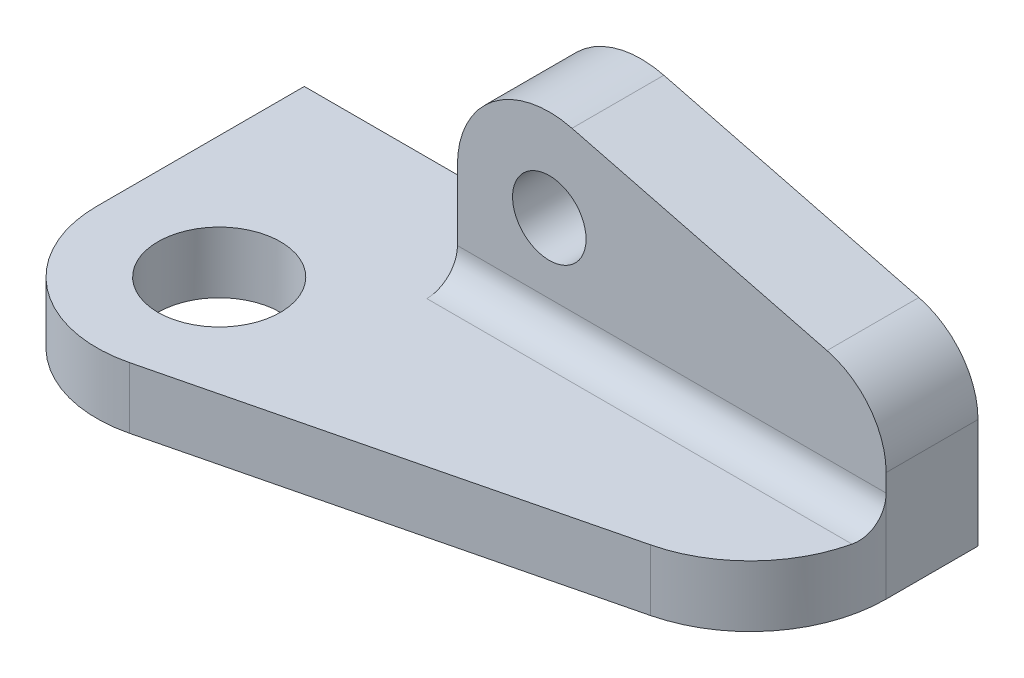
ISO-10303-21;
HEADER;
FILE_DESCRIPTION(('STEP AP214'),'2;1');
FILE_NAME('part.step','',(''),(''),'','','');
FILE_SCHEMA(('AUTOMOTIVE_DESIGN { 1 0 10303 214 1 1 1 1 }'));
ENDSEC;
DATA;
#1=APPLICATION_CONTEXT('core data for automotive mechanical design processes');
#2=APPLICATION_PROTOCOL_DEFINITION('international standard','automotive_design',2000,#1);
#3=PRODUCT_CONTEXT('',#1,'mechanical');
#4=PRODUCT('Part','Part','',(#3));
#5=PRODUCT_RELATED_PRODUCT_CATEGORY('part','',(#4));
#6=PRODUCT_DEFINITION_FORMATION('','',#4);
#7=PRODUCT_DEFINITION_CONTEXT('part definition',#1,'design');
#8=PRODUCT_DEFINITION('design','',#6,#7);
#9=PRODUCT_DEFINITION_SHAPE('','',#8);
#10=(LENGTH_UNIT() NAMED_UNIT(*) SI_UNIT(.MILLI.,.METRE.));
#11=(NAMED_UNIT(*) PLANE_ANGLE_UNIT() SI_UNIT($,.RADIAN.));
#12=(NAMED_UNIT(*) SI_UNIT($,.STERADIAN.) SOLID_ANGLE_UNIT());
#13=UNCERTAINTY_MEASURE_WITH_UNIT(LENGTH_MEASURE(1.E-05),#10,'distance_accuracy_value','');
#14=(GEOMETRIC_REPRESENTATION_CONTEXT(3) GLOBAL_UNCERTAINTY_ASSIGNED_CONTEXT((#13)) GLOBAL_UNIT_ASSIGNED_CONTEXT((#10,
#11,#12)) REPRESENTATION_CONTEXT('',''));
#15=CARTESIAN_POINT('',(0.,0.,0.));
#16=DIRECTION('',(0.,0.,1.));
#17=DIRECTION('',(1.,0.,0.));
#18=AXIS2_PLACEMENT_3D('',#15,#16,#17);
#19=CARTESIAN_POINT('',(55.,26.4,15.));
#20=DIRECTION('',(0.,0.,-1.));
#21=DIRECTION('',(-1.,0.,0.));
#22=AXIS2_PLACEMENT_3D('',#19,#20,#21);
#23=PLANE('',#22);
#24=DIRECTION('',(0.,1.,0.));
#25=VECTOR('',#24,1.);
#26=CARTESIAN_POINT('',(40.,10.,15.));
#27=LINE('',#26,#25);
#28=CARTESIAN_POINT('',(40.,15.,15.));
#29=VERTEX_POINT('',#28);
#30=CARTESIAN_POINT('',(40.,26.4,15.));
#31=VERTEX_POINT('',#30);
#32=EDGE_CURVE('E142',#29,#31,#27,.T.);
#33=ORIENTED_EDGE('',*,*,#32,.F.);
#34=DIRECTION('',(-1.,0.,0.));
#35=VECTOR('',#34,1.);
#36=CARTESIAN_POINT('',(110.,15.,15.));
#37=LINE('',#36,#35);
#38=CARTESIAN_POINT('',(110.,15.,15.));
#39=VERTEX_POINT('',#38);
#40=EDGE_CURVE('E258',#29,#39,#37,.F.);
#41=ORIENTED_EDGE('',*,*,#40,.T.);
#42=DIRECTION('',(0.,-1.,0.));
#43=VECTOR('',#42,1.);
#44=CARTESIAN_POINT('',(110.,17.9,15.));
#45=LINE('',#44,#43);
#46=CARTESIAN_POINT('',(110.,17.9,15.));
#47=VERTEX_POINT('',#46);
#48=EDGE_CURVE('E170',#47,#39,#45,.T.);
#49=ORIENTED_EDGE('',*,*,#48,.F.);
#50=CARTESIAN_POINT('',(97.1798506039238,17.9,15.));
#51=DIRECTION('',(0.,0.,-1.));
#52=DIRECTION('',(-1.,0.,0.));
#53=AXIS2_PLACEMENT_3D('',#50,#51,#52);
#54=CIRCLE('',#53,12.8201493960762);
#55=CARTESIAN_POINT('',(100.345866401289,30.3230662281316,15.));
#56=VERTEX_POINT('',#55);
#57=EDGE_CURVE('E151',#56,#47,#54,.T.);
#58=ORIENTED_EDGE('',*,*,#57,.F.);
#59=DIRECTION('',(0.969026634895055,-0.246956232689044,0.));
#60=VECTOR('',#59,1.);
#61=CARTESIAN_POINT('',(58.7043434903357,40.9353995234258,15.));
#62=LINE('',#61,#60);
#63=CARTESIAN_POINT('',(58.7043434903357,40.9353995234258,15.));
#64=VERTEX_POINT('',#63);
#65=EDGE_CURVE('E133',#64,#56,#62,.T.);
#66=ORIENTED_EDGE('',*,*,#65,.F.);
#67=CARTESIAN_POINT('',(55.,26.4,15.));
#68=DIRECTION('',(0.,0.,-1.));
#69=DIRECTION('',(-1.,0.,0.));
#70=AXIS2_PLACEMENT_3D('',#67,#68,#69);
#71=CIRCLE('',#70,15.);
#72=EDGE_CURVE('E148',#31,#64,#71,.T.);
#73=ORIENTED_EDGE('',*,*,#72,.F.);
#74=EDGE_LOOP('',(#33,#41,#49,#58,#66,#73));
#75=FACE_BOUND('',#74,.T.);
#76=CARTESIAN_POINT('',(55.,26.4,15.));
#77=DIRECTION('',(0.,0.,1.));
#78=DIRECTION('',(1.,0.,0.));
#79=AXIS2_PLACEMENT_3D('',#76,#77,#78);
#80=CIRCLE('',#79,6.);
#81=CARTESIAN_POINT('',(61.,26.4,15.));
#82=VERTEX_POINT('',#81);
#83=EDGE_CURVE('E323',#82,#82,#80,.T.);
#84=ORIENTED_EDGE('',*,*,#83,.F.);
#85=EDGE_LOOP('',(#84));
#86=FACE_BOUND('',#85,.T.);
#87=ADVANCED_FACE('F39',(#75,#86),#23,.F.);
#88=CARTESIAN_POINT('',(87.8068095877396,10.,15.));
#89=DIRECTION('',(0.,-1.,0.));
#90=DIRECTION('',(0.,0.,-1.));
#91=AXIS2_PLACEMENT_3D('',#88,#89,#90);
#92=PLANE('',#91);
#93=CARTESIAN_POINT('',(87.8068095877396,10.,15.));
#94=DIRECTION('',(0.,1.,0.));
#95=DIRECTION('',(0.,0.,-1.));
#96=AXIS2_PLACEMENT_3D('',#93,#94,#95);
#97=CIRCLE('',#96,22.1931904122604);
#98=CARTESIAN_POINT('',(93.096662434136,10.,36.5535416472171));
#99=VERTEX_POINT('',#98);
#100=CARTESIAN_POINT('',(109.429429703601,10.,20.));
#101=VERTEX_POINT('',#100);
#102=EDGE_CURVE('E208',#99,#101,#97,.T.);
#103=ORIENTED_EDGE('',*,*,#102,.T.);
#104=DIRECTION('',(-1.,0.,0.));
#105=VECTOR('',#104,1.);
#106=CARTESIAN_POINT('',(40.,10.,20.));
#107=LINE('',#106,#105);
#108=CARTESIAN_POINT('',(40.,10.,20.));
#109=VERTEX_POINT('',#108);
#110=EDGE_CURVE('E254',#101,#109,#107,.T.);
#111=ORIENTED_EDGE('',*,*,#110,.T.);
#112=DIRECTION('',(0.,0.,-1.));
#113=VECTOR('',#112,1.);
#114=CARTESIAN_POINT('',(40.,10.,15.));
#115=LINE('',#114,#113);
#116=CARTESIAN_POINT('',(40.,10.,0.));
#117=VERTEX_POINT('',#116);
#118=EDGE_CURVE('E187',#109,#117,#115,.T.);
#119=ORIENTED_EDGE('',*,*,#118,.T.);
#120=DIRECTION('',(-1.,0.,0.));
#121=VECTOR('',#120,1.);
#122=CARTESIAN_POINT('',(0.,10.,0.));
#123=LINE('',#122,#121);
#124=CARTESIAN_POINT('',(0.,10.,0.));
#125=VERTEX_POINT('',#124);
#126=EDGE_CURVE('E212',#117,#125,#123,.T.);
#127=ORIENTED_EDGE('',*,*,#126,.T.);
#128=DIRECTION('',(0.,0.,1.));
#129=VECTOR('',#128,1.);
#130=CARTESIAN_POINT('',(0.,10.,33.9));
#131=LINE('',#130,#129);
#132=CARTESIAN_POINT('',(0.,10.,33.9));
#133=VERTEX_POINT('',#132);
#134=EDGE_CURVE('E197',#125,#133,#131,.T.);
#135=ORIENTED_EDGE('',*,*,#134,.T.);
#136=CARTESIAN_POINT('',(20.,10.,33.9));
#137=DIRECTION('',(0.,1.,0.));
#138=DIRECTION('',(0.,0.,-1.));
#139=AXIS2_PLACEMENT_3D('',#136,#137,#138);
#140=CIRCLE('',#139,20.);
#141=CARTESIAN_POINT('',(24.7670954451633,10.,53.3235630360834));
#142=VERTEX_POINT('',#141);
#143=EDGE_CURVE('E201',#133,#142,#140,.T.);
#144=ORIENTED_EDGE('',*,*,#143,.T.);
#145=DIRECTION('',(0.971178151804168,0.,-0.238354772258164));
#146=VECTOR('',#145,1.);
#147=CARTESIAN_POINT('',(93.096662434136,10.,36.5535416472171));
#148=LINE('',#147,#146);
#149=EDGE_CURVE('E205',#142,#99,#148,.T.);
#150=ORIENTED_EDGE('',*,*,#149,.T.);
#151=EDGE_LOOP('',(#103,#111,#119,#127,#135,#144,#150));
#152=FACE_BOUND('',#151,.T.);
#153=CARTESIAN_POINT('',(20.,10.,33.9));
#154=DIRECTION('',(0.,1.,0.));
#155=DIRECTION('',(0.,0.,1.));
#156=AXIS2_PLACEMENT_3D('',#153,#154,#155);
#157=CIRCLE('',#156,9.99999999999999);
#158=CARTESIAN_POINT('',(20.,10.,43.9));
#159=VERTEX_POINT('',#158);
#160=EDGE_CURVE('E327',#159,#159,#157,.T.);
#161=ORIENTED_EDGE('',*,*,#160,.F.);
#162=EDGE_LOOP('',(#161));
#163=FACE_BOUND('',#162,.T.);
#164=ADVANCED_FACE('F271',(#152,#163),#92,.F.);
#165=CARTESIAN_POINT('',(0.,10.,33.9));
#166=DIRECTION('',(1.,0.,0.));
#167=DIRECTION('',(0.,0.,-1.));
#168=AXIS2_PLACEMENT_3D('',#165,#166,#167);
#169=PLANE('',#168);
#170=DIRECTION('',(0.,0.,1.));
#171=VECTOR('',#170,1.);
#172=CARTESIAN_POINT('',(0.,0.,33.9));
#173=LINE('',#172,#171);
#174=CARTESIAN_POINT('',(0.,0.,0.));
#175=VERTEX_POINT('',#174);
#176=CARTESIAN_POINT('',(0.,0.,33.9));
#177=VERTEX_POINT('',#176);
#178=EDGE_CURVE('E186',#175,#177,#173,.T.);
#179=ORIENTED_EDGE('',*,*,#178,.T.);
#180=DIRECTION('',(0.,-1.,0.));
#181=VECTOR('',#180,1.);
#182=CARTESIAN_POINT('',(0.,10.,33.9));
#183=LINE('',#182,#181);
#184=EDGE_CURVE('E250',#133,#177,#183,.T.);
#185=ORIENTED_EDGE('',*,*,#184,.F.);
#186=ORIENTED_EDGE('',*,*,#134,.F.);
#187=DIRECTION('',(0.,-1.,0.));
#188=VECTOR('',#187,1.);
#189=CARTESIAN_POINT('',(0.,10.,0.));
#190=LINE('',#189,#188);
#191=EDGE_CURVE('E215',#125,#175,#190,.T.);
#192=ORIENTED_EDGE('',*,*,#191,.T.);
#193=EDGE_LOOP('',(#179,#185,#186,#192));
#194=FACE_BOUND('',#193,.T.);
#195=ADVANCED_FACE('F305',(#194),#169,.F.);
#196=CARTESIAN_POINT('',(20.,10.,33.9));
#197=DIRECTION('',(0.,-1.,0.));
#198=DIRECTION('',(0.,0.,-1.));
#199=AXIS2_PLACEMENT_3D('',#196,#197,#198);
#200=CYLINDRICAL_SURFACE('',#199,20.);
#201=CARTESIAN_POINT('',(20.,0.,33.9));
#202=DIRECTION('',(0.,1.,0.));
#203=DIRECTION('',(0.,0.,-1.));
#204=AXIS2_PLACEMENT_3D('',#201,#202,#203);
#205=CIRCLE('',#204,20.);
#206=CARTESIAN_POINT('',(24.7670954451633,0.,53.3235630360834));
#207=VERTEX_POINT('',#206);
#208=EDGE_CURVE('E219',#177,#207,#205,.T.);
#209=ORIENTED_EDGE('',*,*,#208,.T.);
#210=DIRECTION('',(0.,-1.,0.));
#211=VECTOR('',#210,1.);
#212=CARTESIAN_POINT('',(24.7670954451633,10.,53.3235630360834));
#213=LINE('',#212,#211);
#214=EDGE_CURVE('E246',#142,#207,#213,.T.);
#215=ORIENTED_EDGE('',*,*,#214,.F.);
#216=ORIENTED_EDGE('',*,*,#143,.F.);
#217=ORIENTED_EDGE('',*,*,#184,.T.);
#218=EDGE_LOOP('',(#209,#215,#216,#217));
#219=FACE_BOUND('',#218,.T.);
#220=ADVANCED_FACE('F353',(#219),#200,.T.);
#221=CARTESIAN_POINT('',(93.096662434136,10.,36.5535416472171));
#222=DIRECTION('',(-0.238354772258164,0.,-0.971178151804168));
#223=DIRECTION('',(-0.971178151804168,0.,0.238354772258164));
#224=AXIS2_PLACEMENT_3D('',#221,#222,#223);
#225=PLANE('',#224);
#226=DIRECTION('',(0.971178151804168,0.,-0.238354772258164));
#227=VECTOR('',#226,1.);
#228=CARTESIAN_POINT('',(93.096662434136,0.,36.5535416472171));
#229=LINE('',#228,#227);
#230=CARTESIAN_POINT('',(93.096662434136,0.,36.5535416472171));
#231=VERTEX_POINT('',#230);
#232=EDGE_CURVE('E222',#207,#231,#229,.T.);
#233=ORIENTED_EDGE('',*,*,#232,.T.);
#234=DIRECTION('',(0.,-1.,0.));
#235=VECTOR('',#234,1.);
#236=CARTESIAN_POINT('',(93.096662434136,10.,36.5535416472171));
#237=LINE('',#236,#235);
#238=EDGE_CURVE('E242',#99,#231,#237,.T.);
#239=ORIENTED_EDGE('',*,*,#238,.F.);
#240=ORIENTED_EDGE('',*,*,#149,.F.);
#241=ORIENTED_EDGE('',*,*,#214,.T.);
#242=EDGE_LOOP('',(#233,#239,#240,#241));
#243=FACE_BOUND('',#242,.T.);
#244=ADVANCED_FACE('F277',(#243),#225,.F.);
#245=CARTESIAN_POINT('',(87.8068095877396,10.,15.));
#246=DIRECTION('',(0.,-1.,0.));
#247=DIRECTION('',(0.,0.,-1.));
#248=AXIS2_PLACEMENT_3D('',#245,#246,#247);
#249=CYLINDRICAL_SURFACE('',#248,22.1931904122604);
#250=CARTESIAN_POINT('',(87.8068095877396,0.,15.));
#251=DIRECTION('',(0.,1.,0.));
#252=DIRECTION('',(0.,0.,-1.));
#253=AXIS2_PLACEMENT_3D('',#250,#251,#252);
#254=CIRCLE('',#253,22.1931904122604);
#255=CARTESIAN_POINT('',(110.,0.,15.));
#256=VERTEX_POINT('',#255);
#257=EDGE_CURVE('E225',#231,#256,#254,.T.);
#258=ORIENTED_EDGE('',*,*,#257,.T.);
#259=DIRECTION('',(0.,-1.,0.));
#260=VECTOR('',#259,1.);
#261=CARTESIAN_POINT('',(110.,10.,15.));
#262=LINE('',#261,#260);
#263=EDGE_CURVE('E60',#39,#256,#262,.T.);
#264=ORIENTED_EDGE('',*,*,#263,.F.);
#265=CARTESIAN_POINT('',(110.,15.,15.));
#266=CARTESIAN_POINT('',(109.999989949596,14.8594403559542,14.999984908058));
#267=CARTESIAN_POINT('',(109.999999684347,14.7188828725224,15.0059264710467));
#268=CARTESIAN_POINT('',(109.999986087323,14.4387722644995,15.0296139281734));
#269=CARTESIAN_POINT('',(109.999962757064,14.2992190941747,15.0473592813175));
#270=CARTESIAN_POINT('',(109.999810456407,14.0221965300017,15.0945296172818));
#271=CARTESIAN_POINT('',(109.999681556502,13.8847258079803,15.1239467995514));
#272=CARTESIAN_POINT('',(109.999177907867,13.6127502802735,15.1942468570429));
#273=CARTESIAN_POINT('',(109.998803162147,13.4782454382889,15.2351295918542));
#274=CARTESIAN_POINT('',(109.997623381256,13.213111729625,15.3280869194592));
#275=CARTESIAN_POINT('',(109.996818202836,13.0824841686003,15.3801652347199));
#276=CARTESIAN_POINT('',(109.994550099353,12.8260350028324,15.4951547910606));
#277=CARTESIAN_POINT('',(109.993086931769,12.7002151887009,15.5580700211386));
#278=CARTESIAN_POINT('',(109.989243525603,12.4543961993003,15.6942326130346));
#279=CARTESIAN_POINT('',(109.986863764927,12.3343940273976,15.7674745779627));
#280=CARTESIAN_POINT('',(109.980902363611,12.1009601059549,15.9238121413313));
#281=CARTESIAN_POINT('',(109.977320307631,11.9875306428981,16.0069111385202));
#282=CARTESIAN_POINT('',(109.968667306191,11.7683554487751,16.1821323513195));
#283=CARTESIAN_POINT('',(109.963599786572,11.6625927287029,16.274233483606));
#284=CARTESIAN_POINT('',(109.951676194367,11.4592264646314,16.4669354265543));
#285=CARTESIAN_POINT('',(109.944820137751,11.3616228477881,16.5675361613161));
#286=CARTESIAN_POINT('',(109.929031972836,11.1752574232325,16.7765008045715));
#287=CARTESIAN_POINT('',(109.920099496449,11.0864971871843,16.8848660871344));
#288=CARTESIAN_POINT('',(109.899899401299,10.9184993061035,17.1084776941104));
#289=CARTESIAN_POINT('',(109.888632623604,10.8392582474322,17.2237215295045));
#290=CARTESIAN_POINT('',(109.863637996612,10.6914298748782,17.4592532053751));
#291=CARTESIAN_POINT('',(109.849931375766,10.622759504311,17.5794911747538));
#292=CARTESIAN_POINT('',(109.819822928085,10.4957626639631,17.8249292615893));
#293=CARTESIAN_POINT('',(109.803422090595,10.4374324134695,17.9501275448092));
#294=CARTESIAN_POINT('',(109.767794279768,10.3314385902611,18.2045821600509));
#295=CARTESIAN_POINT('',(109.748567209996,10.283775381663,18.3338386304262));
#296=CARTESIAN_POINT('',(109.707233392087,10.1993848296787,18.5953698703781));
#297=CARTESIAN_POINT('',(109.685127224403,10.1626552868562,18.7276440271395));
#298=CARTESIAN_POINT('',(109.628411871951,10.0875641583657,19.0486521525951));
#299=CARTESIAN_POINT('',(109.592376763038,10.0546273755724,19.2384454260268));
#300=CARTESIAN_POINT('',(109.534242260786,10.0217942847223,19.5239179265219));
#301=CARTESIAN_POINT('',(109.514196198898,10.0136118871815,19.6191521100318));
#302=CARTESIAN_POINT('',(109.472788609081,10.0027158626031,19.809631290206));
#303=CARTESIAN_POINT('',(109.451427299282,10.0000013312406,19.9048762824765));
#304=CARTESIAN_POINT('',(109.429429703601,10.,20.));
#305=B_SPLINE_CURVE_WITH_KNOTS('',3,(#265,#266,#267,#268,#269,#270,#271,#272,#273,#274,#275,
#276,#277,#278,#279,#280,#281,#282,#283,#284,#285,#286,#287,#288,#289,#290,#291,#292,#293,#294,
#295,#296,#297,#298,#299,#300,#301,#302,#303,#304),.UNSPECIFIED.,.F.,.F.,(4,2,2,2,2,2,2,2,2,2,2,
2,2,2,2,2,2,2,2,4),(0.,0.421550364900715,0.843081410543415,1.26433121058864,1.68557585210821,
2.10696077230974,2.52850113433608,2.94982200472543,3.37128857303472,3.79179068323795,
4.21228903882171,4.63286199344026,5.05328367477576,5.47021182558199,5.88698721688913,
6.30377683254523,6.7204825492926,7.30685871623747,7.59971776562288,7.89252837537239),.UNSPECIFIED.);
#306=EDGE_CURVE('E11',#39,#101,#305,.T.);
#307=ORIENTED_EDGE('',*,*,#306,.T.);
#308=ORIENTED_EDGE('',*,*,#102,.F.);
#309=ORIENTED_EDGE('',*,*,#238,.T.);
#310=EDGE_LOOP('',(#258,#264,#307,#308,#309));
#311=FACE_BOUND('',#310,.T.);
#312=ADVANCED_FACE('F269',(#311),#249,.T.);
#313=CARTESIAN_POINT('',(110.,10.,0.));
#314=DIRECTION('',(-1.,0.,0.));
#315=DIRECTION('',(0.,0.,1.));
#316=AXIS2_PLACEMENT_3D('',#313,#314,#315);
#317=PLANE('',#316);
#318=DIRECTION('',(0.,0.,-1.));
#319=VECTOR('',#318,1.);
#320=CARTESIAN_POINT('',(110.,0.,0.));
#321=LINE('',#320,#319);
#322=CARTESIAN_POINT('',(110.,0.,0.));
#323=VERTEX_POINT('',#322);
#324=EDGE_CURVE('E228',#256,#323,#321,.T.);
#325=ORIENTED_EDGE('',*,*,#324,.T.);
#326=DIRECTION('',(0.,-1.,0.));
#327=VECTOR('',#326,1.);
#328=CARTESIAN_POINT('',(110.,10.,0.));
#329=LINE('',#328,#327);
#330=CARTESIAN_POINT('',(110.,17.9,0.));
#331=VERTEX_POINT('',#330);
#332=EDGE_CURVE('E236',#331,#323,#329,.T.);
#333=ORIENTED_EDGE('',*,*,#332,.F.);
#334=DIRECTION('',(0.,0.,-1.));
#335=VECTOR('',#334,1.);
#336=CARTESIAN_POINT('',(110.,17.9,15.));
#337=LINE('',#336,#335);
#338=EDGE_CURVE('E191',#47,#331,#337,.T.);
#339=ORIENTED_EDGE('',*,*,#338,.F.);
#340=ORIENTED_EDGE('',*,*,#48,.T.);
#341=ORIENTED_EDGE('',*,*,#263,.T.);
#342=EDGE_LOOP('',(#325,#333,#339,#340,#341));
#343=FACE_BOUND('',#342,.T.);
#344=ADVANCED_FACE('F265',(#343),#317,.F.);
#345=CARTESIAN_POINT('',(0.,10.,0.));
#346=DIRECTION('',(0.,0.,1.));
#347=DIRECTION('',(1.,0.,0.));
#348=AXIS2_PLACEMENT_3D('',#345,#346,#347);
#349=PLANE('',#348);
#350=CARTESIAN_POINT('',(55.,26.4,0.));
#351=DIRECTION('',(0.,0.,1.));
#352=DIRECTION('',(1.,0.,0.));
#353=AXIS2_PLACEMENT_3D('',#350,#351,#352);
#354=CIRCLE('',#353,6.);
#355=CARTESIAN_POINT('',(61.,26.4,0.));
#356=VERTEX_POINT('',#355);
#357=EDGE_CURVE('E320',#356,#356,#354,.T.);
#358=ORIENTED_EDGE('',*,*,#357,.T.);
#359=EDGE_LOOP('',(#358));
#360=FACE_BOUND('',#359,.T.);
#361=DIRECTION('',(-1.,0.,0.));
#362=VECTOR('',#361,1.);
#363=CARTESIAN_POINT('',(0.,0.,0.));
#364=LINE('',#363,#362);
#365=EDGE_CURVE('E202',#323,#175,#364,.T.);
#366=ORIENTED_EDGE('',*,*,#365,.T.);
#367=ORIENTED_EDGE('',*,*,#191,.F.);
#368=ORIENTED_EDGE('',*,*,#126,.F.);
#369=DIRECTION('',(0.,1.,0.));
#370=VECTOR('',#369,1.);
#371=CARTESIAN_POINT('',(40.,10.,0.));
#372=LINE('',#371,#370);
#373=CARTESIAN_POINT('',(40.,26.4,0.));
#374=VERTEX_POINT('',#373);
#375=EDGE_CURVE('E158',#117,#374,#372,.T.);
#376=ORIENTED_EDGE('',*,*,#375,.T.);
#377=CARTESIAN_POINT('',(55.,26.4,0.));
#378=DIRECTION('',(0.,0.,-1.));
#379=DIRECTION('',(-1.,0.,0.));
#380=AXIS2_PLACEMENT_3D('',#377,#378,#379);
#381=CIRCLE('',#380,15.);
#382=CARTESIAN_POINT('',(58.7043434903357,40.9353995234258,0.));
#383=VERTEX_POINT('',#382);
#384=EDGE_CURVE('E176',#374,#383,#381,.T.);
#385=ORIENTED_EDGE('',*,*,#384,.T.);
#386=DIRECTION('',(0.969026634895055,-0.246956232689044,0.));
#387=VECTOR('',#386,1.);
#388=CARTESIAN_POINT('',(58.7043434903357,40.9353995234258,0.));
#389=LINE('',#388,#387);
#390=CARTESIAN_POINT('',(100.345866401289,30.3230662281316,0.));
#391=VERTEX_POINT('',#390);
#392=EDGE_CURVE('E135',#383,#391,#389,.T.);
#393=ORIENTED_EDGE('',*,*,#392,.T.);
#394=CARTESIAN_POINT('',(97.1798506039238,17.9,0.));
#395=DIRECTION('',(0.,0.,-1.));
#396=DIRECTION('',(-1.,0.,0.));
#397=AXIS2_PLACEMENT_3D('',#394,#395,#396);
#398=CIRCLE('',#397,12.8201493960762);
#399=EDGE_CURVE('E162',#391,#331,#398,.T.);
#400=ORIENTED_EDGE('',*,*,#399,.T.);
#401=ORIENTED_EDGE('',*,*,#332,.T.);
#402=EDGE_LOOP('',(#366,#367,#368,#376,#385,#393,#400,#401));
#403=FACE_BOUND('',#402,.T.);
#404=ADVANCED_FACE('F285',(#360,#403),#349,.F.);
#405=CARTESIAN_POINT('',(87.8068095877396,0.,15.));
#406=DIRECTION('',(0.,-1.,0.));
#407=DIRECTION('',(0.,0.,-1.));
#408=AXIS2_PLACEMENT_3D('',#405,#406,#407);
#409=PLANE('',#408);
#410=CARTESIAN_POINT('',(20.,0.,33.9));
#411=DIRECTION('',(0.,-1.,0.));
#412=DIRECTION('',(0.,0.,-1.));
#413=AXIS2_PLACEMENT_3D('',#410,#411,#412);
#414=CIRCLE('',#413,10.);
#415=CARTESIAN_POINT('',(20.,0.,23.9));
#416=VERTEX_POINT('',#415);
#417=EDGE_CURVE('E165',#416,#416,#414,.T.);
#418=ORIENTED_EDGE('',*,*,#417,.F.);
#419=EDGE_LOOP('',(#418));
#420=FACE_BOUND('',#419,.T.);
#421=ORIENTED_EDGE('',*,*,#178,.F.);
#422=ORIENTED_EDGE('',*,*,#365,.F.);
#423=ORIENTED_EDGE('',*,*,#324,.F.);
#424=ORIENTED_EDGE('',*,*,#257,.F.);
#425=ORIENTED_EDGE('',*,*,#232,.F.);
#426=ORIENTED_EDGE('',*,*,#208,.F.);
#427=EDGE_LOOP('',(#421,#422,#423,#424,#425,#426));
#428=FACE_BOUND('',#427,.T.);
#429=ADVANCED_FACE('F282',(#420,#428),#409,.T.);
#430=CARTESIAN_POINT('',(55.,26.4,15.));
#431=DIRECTION('',(0.,0.,-1.));
#432=DIRECTION('',(-1.,0.,0.));
#433=AXIS2_PLACEMENT_3D('',#430,#431,#432);
#434=CYLINDRICAL_SURFACE('',#433,15.);
#435=ORIENTED_EDGE('',*,*,#384,.F.);
#436=DIRECTION('',(0.,0.,-1.));
#437=VECTOR('',#436,1.);
#438=CARTESIAN_POINT('',(40.,26.4,15.));
#439=LINE('',#438,#437);
#440=EDGE_CURVE('E156',#31,#374,#439,.T.);
#441=ORIENTED_EDGE('',*,*,#440,.F.);
#442=ORIENTED_EDGE('',*,*,#72,.T.);
#443=DIRECTION('',(0.,0.,-1.));
#444=VECTOR('',#443,1.);
#445=CARTESIAN_POINT('',(58.7043434903357,40.9353995234258,15.));
#446=LINE('',#445,#444);
#447=EDGE_CURVE('E130',#64,#383,#446,.T.);
#448=ORIENTED_EDGE('',*,*,#447,.T.);
#449=EDGE_LOOP('',(#435,#441,#442,#448));
#450=FACE_BOUND('',#449,.T.);
#451=ADVANCED_FACE('F155',(#450),#434,.T.);
#452=CARTESIAN_POINT('',(40.,10.,15.));
#453=DIRECTION('',(-1.,0.,0.));
#454=DIRECTION('',(0.,0.,1.));
#455=AXIS2_PLACEMENT_3D('',#452,#453,#454);
#456=PLANE('',#455);
#457=ORIENTED_EDGE('',*,*,#375,.F.);
#458=ORIENTED_EDGE('',*,*,#118,.F.);
#459=CARTESIAN_POINT('',(40.,15.,20.));
#460=DIRECTION('',(-1.,0.,0.));
#461=DIRECTION('',(0.,0.,1.));
#462=AXIS2_PLACEMENT_3D('',#459,#460,#461);
#463=CIRCLE('',#462,5.);
#464=EDGE_CURVE('E54',#109,#29,#463,.F.);
#465=ORIENTED_EDGE('',*,*,#464,.T.);
#466=ORIENTED_EDGE('',*,*,#32,.T.);
#467=ORIENTED_EDGE('',*,*,#440,.T.);
#468=EDGE_LOOP('',(#457,#458,#465,#466,#467));
#469=FACE_BOUND('',#468,.T.);
#470=ADVANCED_FACE('F291',(#469),#456,.T.);
#471=CARTESIAN_POINT('',(97.1798506039238,17.9,15.));
#472=DIRECTION('',(0.,0.,-1.));
#473=DIRECTION('',(-1.,0.,0.));
#474=AXIS2_PLACEMENT_3D('',#471,#472,#473);
#475=CYLINDRICAL_SURFACE('',#474,12.8201493960762);
#476=ORIENTED_EDGE('',*,*,#399,.F.);
#477=DIRECTION('',(0.,0.,-1.));
#478=VECTOR('',#477,1.);
#479=CARTESIAN_POINT('',(100.345866401289,30.3230662281316,15.));
#480=LINE('',#479,#478);
#481=EDGE_CURVE('E141',#56,#391,#480,.T.);
#482=ORIENTED_EDGE('',*,*,#481,.F.);
#483=ORIENTED_EDGE('',*,*,#57,.T.);
#484=ORIENTED_EDGE('',*,*,#338,.T.);
#485=EDGE_LOOP('',(#476,#482,#483,#484));
#486=FACE_BOUND('',#485,.T.);
#487=ADVANCED_FACE('F289',(#486),#475,.T.);
#488=CARTESIAN_POINT('',(58.7043434903357,40.9353995234258,15.));
#489=DIRECTION('',(0.246956232689044,0.969026634895055,0.));
#490=DIRECTION('',(-0.969026634895055,0.246956232689044,0.));
#491=AXIS2_PLACEMENT_3D('',#488,#489,#490);
#492=PLANE('',#491);
#493=ORIENTED_EDGE('',*,*,#392,.F.);
#494=ORIENTED_EDGE('',*,*,#447,.F.);
#495=ORIENTED_EDGE('',*,*,#65,.T.);
#496=ORIENTED_EDGE('',*,*,#481,.T.);
#497=EDGE_LOOP('',(#493,#494,#495,#496));
#498=FACE_BOUND('',#497,.T.);
#499=ADVANCED_FACE('F132',(#498),#492,.T.);
#500=CARTESIAN_POINT('',(20.,10.,33.9));
#501=DIRECTION('',(0.,1.,0.));
#502=DIRECTION('',(0.,0.,1.));
#503=AXIS2_PLACEMENT_3D('',#500,#501,#502);
#504=CYLINDRICAL_SURFACE('',#503,10.);
#505=ORIENTED_EDGE('',*,*,#160,.T.);
#506=EDGE_LOOP('',(#505));
#507=FACE_BOUND('',#506,.T.);
#508=ORIENTED_EDGE('',*,*,#417,.T.);
#509=EDGE_LOOP('',(#508));
#510=FACE_BOUND('',#509,.T.);
#511=ADVANCED_FACE('F297',(#507,#510),#504,.F.);
#512=CARTESIAN_POINT('',(55.,26.4,15.));
#513=DIRECTION('',(0.,0.,1.));
#514=DIRECTION('',(1.,0.,0.));
#515=AXIS2_PLACEMENT_3D('',#512,#513,#514);
#516=CYLINDRICAL_SURFACE('',#515,6.);
#517=ORIENTED_EDGE('',*,*,#357,.F.);
#518=EDGE_LOOP('',(#517));
#519=FACE_BOUND('',#518,.T.);
#520=ORIENTED_EDGE('',*,*,#83,.T.);
#521=EDGE_LOOP('',(#520));
#522=FACE_BOUND('',#521,.T.);
#523=ADVANCED_FACE('F310',(#519,#522),#516,.F.);
#524=CARTESIAN_POINT('',(87.8068095877396,15.,20.));
#525=DIRECTION('',(1.,0.,0.));
#526=DIRECTION('',(0.,0.,-1.));
#527=AXIS2_PLACEMENT_3D('',#524,#525,#526);
#528=CYLINDRICAL_SURFACE('',#527,5.);
#529=ORIENTED_EDGE('',*,*,#306,.F.);
#530=ORIENTED_EDGE('',*,*,#40,.F.);
#531=ORIENTED_EDGE('',*,*,#464,.F.);
#532=ORIENTED_EDGE('',*,*,#110,.F.);
#533=EDGE_LOOP('',(#529,#530,#531,#532));
#534=FACE_BOUND('',#533,.T.);
#535=ADVANCED_FACE('F41',(#534),#528,.F.);
#536=CLOSED_SHELL('',(#87,#164,#195,#220,#244,#312,#344,#404,#429,#451,#470,#487,#499,#511,#523,#535));
#537=MANIFOLD_SOLID_BREP('B2',#536);
#538=ADVANCED_BREP_SHAPE_REPRESENTATION('',(#18,#537),#14);
#539=SHAPE_DEFINITION_REPRESENTATION(#9,#538);
ENDSEC;
END-ISO-10303-21;
